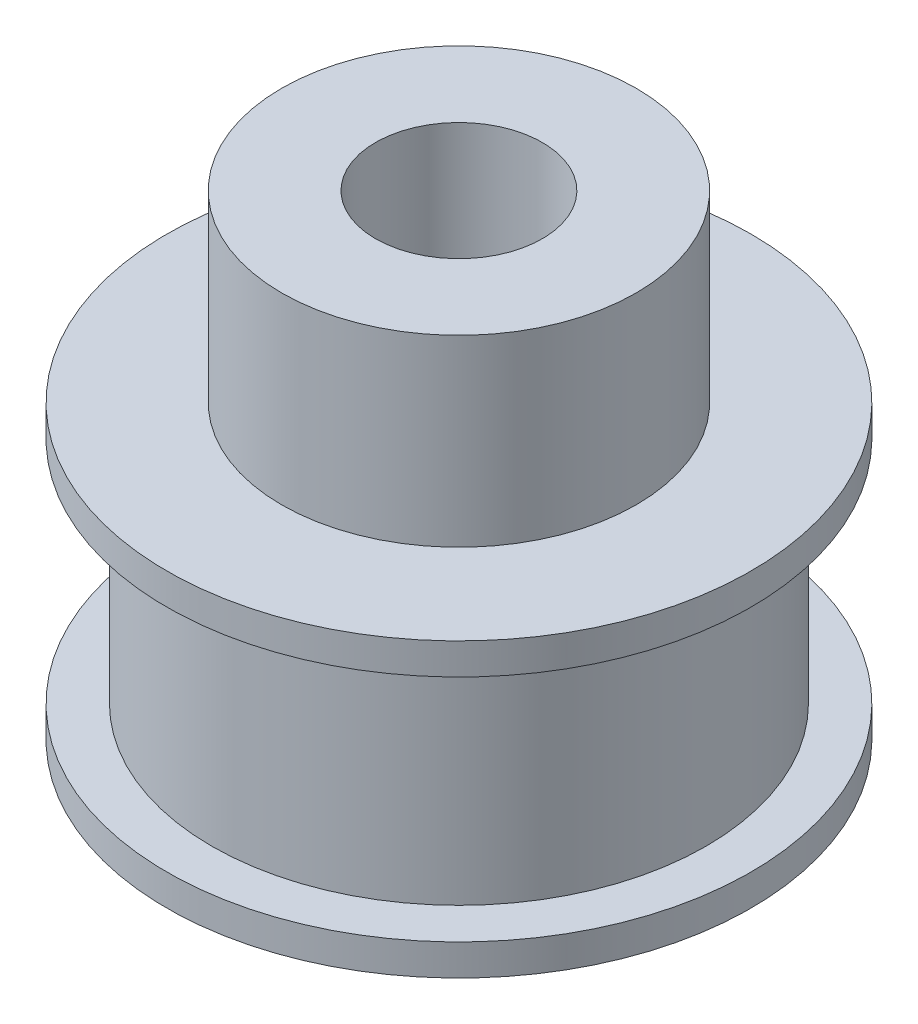
ISO-10303-21;
HEADER;
FILE_DESCRIPTION(('STEP AP214'),'2;1');
FILE_NAME('part.step','',(''),(''),'','','');
FILE_SCHEMA(('AUTOMOTIVE_DESIGN { 1 0 10303 214 1 1 1 1 }'));
ENDSEC;
DATA;
#1=APPLICATION_CONTEXT('core data for automotive mechanical design processes');
#2=APPLICATION_PROTOCOL_DEFINITION('international standard','automotive_design',2000,#1);
#3=PRODUCT_CONTEXT('',#1,'mechanical');
#4=PRODUCT('Part','Part','',(#3));
#5=PRODUCT_RELATED_PRODUCT_CATEGORY('part','',(#4));
#6=PRODUCT_DEFINITION_FORMATION('','',#4);
#7=PRODUCT_DEFINITION_CONTEXT('part definition',#1,'design');
#8=PRODUCT_DEFINITION('design','',#6,#7);
#9=PRODUCT_DEFINITION_SHAPE('','',#8);
#10=(LENGTH_UNIT() NAMED_UNIT(*) SI_UNIT(.MILLI.,.METRE.));
#11=(NAMED_UNIT(*) PLANE_ANGLE_UNIT() SI_UNIT($,.RADIAN.));
#12=(NAMED_UNIT(*) SI_UNIT($,.STERADIAN.) SOLID_ANGLE_UNIT());
#13=UNCERTAINTY_MEASURE_WITH_UNIT(LENGTH_MEASURE(1.E-05),#10,'distance_accuracy_value','');
#14=(GEOMETRIC_REPRESENTATION_CONTEXT(3) GLOBAL_UNCERTAINTY_ASSIGNED_CONTEXT((#13)) GLOBAL_UNIT_ASSIGNED_CONTEXT((#10,
#11,#12)) REPRESENTATION_CONTEXT('',''));
#15=CARTESIAN_POINT('',(0.,0.,0.));
#16=DIRECTION('',(0.,0.,1.));
#17=DIRECTION('',(1.,0.,0.));
#18=AXIS2_PLACEMENT_3D('',#15,#16,#17);
#19=CARTESIAN_POINT('',(0.,25.,0.));
#20=DIRECTION('',(0.,-1.,0.));
#21=DIRECTION('',(0.,0.,-1.));
#22=AXIS2_PLACEMENT_3D('',#19,#20,#21);
#23=CYLINDRICAL_SURFACE('',#22,8.5);
#24=CARTESIAN_POINT('',(0.,14.,0.));
#25=DIRECTION('',(0.,-1.,0.));
#26=DIRECTION('',(0.,0.,-1.));
#27=AXIS2_PLACEMENT_3D('',#24,#25,#26);
#28=CIRCLE('',#27,8.5);
#29=CARTESIAN_POINT('',(0.,14.,-8.5));
#30=VERTEX_POINT('',#29);
#31=EDGE_CURVE('E64',#30,#30,#28,.F.);
#32=ORIENTED_EDGE('',*,*,#31,.T.);
#33=EDGE_LOOP('',(#32));
#34=FACE_BOUND('',#33,.T.);
#35=CARTESIAN_POINT('',(0.,22.8,0.));
#36=DIRECTION('',(0.,1.,0.));
#37=DIRECTION('',(0.,0.,1.));
#38=AXIS2_PLACEMENT_3D('',#35,#36,#37);
#39=CIRCLE('',#38,8.5);
#40=CARTESIAN_POINT('',(0.,22.8,8.5));
#41=VERTEX_POINT('',#40);
#42=EDGE_CURVE('E54',#41,#41,#39,.T.);
#43=ORIENTED_EDGE('',*,*,#42,.F.);
#44=EDGE_LOOP('',(#43));
#45=FACE_BOUND('',#44,.T.);
#46=ADVANCED_FACE('F38',(#34,#45),#23,.T.);
#47=CARTESIAN_POINT('',(0.,0.,0.));
#48=DIRECTION('',(0.,1.,0.));
#49=DIRECTION('',(0.,0.,1.));
#50=AXIS2_PLACEMENT_3D('',#47,#48,#49);
#51=CYLINDRICAL_SURFACE('',#50,4.);
#52=CARTESIAN_POINT('',(0.,0.,0.));
#53=DIRECTION('',(0.,1.,0.));
#54=DIRECTION('',(0.,0.,1.));
#55=AXIS2_PLACEMENT_3D('',#52,#53,#54);
#56=CIRCLE('',#55,4.);
#57=CARTESIAN_POINT('',(0.,0.,4.));
#58=VERTEX_POINT('',#57);
#59=EDGE_CURVE('E46',#58,#58,#56,.F.);
#60=ORIENTED_EDGE('',*,*,#59,.T.);
#61=EDGE_LOOP('',(#60));
#62=FACE_BOUND('',#61,.T.);
#63=CARTESIAN_POINT('',(0.,22.8,0.));
#64=DIRECTION('',(0.,1.,0.));
#65=DIRECTION('',(0.,0.,1.));
#66=AXIS2_PLACEMENT_3D('',#63,#64,#65);
#67=CIRCLE('',#66,4.);
#68=CARTESIAN_POINT('',(0.,22.8,4.));
#69=VERTEX_POINT('',#68);
#70=EDGE_CURVE('E42',#69,#69,#67,.F.);
#71=ORIENTED_EDGE('',*,*,#70,.F.);
#72=EDGE_LOOP('',(#71));
#73=FACE_BOUND('',#72,.T.);
#74=ADVANCED_FACE('F82',(#62,#73),#51,.F.);
#75=CARTESIAN_POINT('',(0.,14.,0.));
#76=DIRECTION('',(0.,-1.,0.));
#77=DIRECTION('',(0.,0.,-1.));
#78=AXIS2_PLACEMENT_3D('',#75,#76,#77);
#79=CYLINDRICAL_SURFACE('',#78,14.);
#80=CARTESIAN_POINT('',(0.,14.,0.));
#81=DIRECTION('',(0.,-1.,0.));
#82=DIRECTION('',(0.,0.,-1.));
#83=AXIS2_PLACEMENT_3D('',#80,#81,#82);
#84=CIRCLE('',#83,14.);
#85=CARTESIAN_POINT('',(0.,14.,-14.));
#86=VERTEX_POINT('',#85);
#87=EDGE_CURVE('E69',#86,#86,#84,.F.);
#88=ORIENTED_EDGE('',*,*,#87,.F.);
#89=EDGE_LOOP('',(#88));
#90=FACE_BOUND('',#89,.T.);
#91=CARTESIAN_POINT('',(0.,12.5,0.));
#92=DIRECTION('',(0.,-1.,0.));
#93=DIRECTION('',(0.,0.,-1.));
#94=AXIS2_PLACEMENT_3D('',#91,#92,#93);
#95=CIRCLE('',#94,14.);
#96=CARTESIAN_POINT('',(0.,12.5,-14.));
#97=VERTEX_POINT('',#96);
#98=EDGE_CURVE('E67',#97,#97,#95,.F.);
#99=ORIENTED_EDGE('',*,*,#98,.T.);
#100=EDGE_LOOP('',(#99));
#101=FACE_BOUND('',#100,.T.);
#102=ADVANCED_FACE('F40',(#90,#101),#79,.T.);
#103=CARTESIAN_POINT('',(0.,14.,0.));
#104=DIRECTION('',(0.,1.,0.));
#105=DIRECTION('',(0.,0.,1.));
#106=AXIS2_PLACEMENT_3D('',#103,#104,#105);
#107=PLANE('',#106);
#108=ORIENTED_EDGE('',*,*,#87,.T.);
#109=EDGE_LOOP('',(#108));
#110=FACE_BOUND('',#109,.T.);
#111=ORIENTED_EDGE('',*,*,#31,.F.);
#112=EDGE_LOOP('',(#111));
#113=FACE_BOUND('',#112,.T.);
#114=ADVANCED_FACE('F97',(#110,#113),#107,.T.);
#115=CARTESIAN_POINT('',(0.,12.5,0.));
#116=DIRECTION('',(0.,1.,0.));
#117=DIRECTION('',(0.,0.,1.));
#118=AXIS2_PLACEMENT_3D('',#115,#116,#117);
#119=PLANE('',#118);
#120=ORIENTED_EDGE('',*,*,#98,.F.);
#121=EDGE_LOOP('',(#120));
#122=FACE_BOUND('',#121,.T.);
#123=CARTESIAN_POINT('',(0.,12.5,0.));
#124=DIRECTION('',(0.,-1.,0.));
#125=DIRECTION('',(0.,0.,-1.));
#126=AXIS2_PLACEMENT_3D('',#123,#124,#125);
#127=CIRCLE('',#126,11.85);
#128=CARTESIAN_POINT('',(0.,12.5,-11.85));
#129=VERTEX_POINT('',#128);
#130=EDGE_CURVE('E61',#129,#129,#127,.T.);
#131=ORIENTED_EDGE('',*,*,#130,.F.);
#132=EDGE_LOOP('',(#131));
#133=FACE_BOUND('',#132,.T.);
#134=ADVANCED_FACE('F95',(#122,#133),#119,.F.);
#135=CARTESIAN_POINT('',(0.,12.5,0.));
#136=DIRECTION('',(0.,-1.,0.));
#137=DIRECTION('',(0.,0.,-1.));
#138=AXIS2_PLACEMENT_3D('',#135,#136,#137);
#139=CYLINDRICAL_SURFACE('',#138,11.85);
#140=CARTESIAN_POINT('',(0.,1.5,0.));
#141=DIRECTION('',(0.,-1.,0.));
#142=DIRECTION('',(0.,0.,-1.));
#143=AXIS2_PLACEMENT_3D('',#140,#141,#142);
#144=CIRCLE('',#143,11.85);
#145=CARTESIAN_POINT('',(0.,1.5,-11.85));
#146=VERTEX_POINT('',#145);
#147=EDGE_CURVE('E58',#146,#146,#144,.T.);
#148=ORIENTED_EDGE('',*,*,#147,.F.);
#149=EDGE_LOOP('',(#148));
#150=FACE_BOUND('',#149,.T.);
#151=ORIENTED_EDGE('',*,*,#130,.T.);
#152=EDGE_LOOP('',(#151));
#153=FACE_BOUND('',#152,.T.);
#154=ADVANCED_FACE('F93',(#150,#153),#139,.T.);
#155=CARTESIAN_POINT('',(0.,1.5,0.));
#156=DIRECTION('',(0.,1.,0.));
#157=DIRECTION('',(0.,0.,1.));
#158=AXIS2_PLACEMENT_3D('',#155,#156,#157);
#159=PLANE('',#158);
#160=CARTESIAN_POINT('',(0.,1.5,0.));
#161=DIRECTION('',(0.,-1.,0.));
#162=DIRECTION('',(0.,0.,-1.));
#163=AXIS2_PLACEMENT_3D('',#160,#161,#162);
#164=CIRCLE('',#163,14.);
#165=CARTESIAN_POINT('',(0.,1.5,-14.));
#166=VERTEX_POINT('',#165);
#167=EDGE_CURVE('E51',#166,#166,#164,.T.);
#168=ORIENTED_EDGE('',*,*,#167,.F.);
#169=EDGE_LOOP('',(#168));
#170=FACE_BOUND('',#169,.T.);
#171=ORIENTED_EDGE('',*,*,#147,.T.);
#172=EDGE_LOOP('',(#171));
#173=FACE_BOUND('',#172,.T.);
#174=ADVANCED_FACE('F119',(#170,#173),#159,.T.);
#175=CARTESIAN_POINT('',(0.,1.5,0.));
#176=DIRECTION('',(0.,-1.,0.));
#177=DIRECTION('',(0.,0.,-1.));
#178=AXIS2_PLACEMENT_3D('',#175,#176,#177);
#179=CYLINDRICAL_SURFACE('',#178,14.);
#180=ORIENTED_EDGE('',*,*,#167,.T.);
#181=EDGE_LOOP('',(#180));
#182=FACE_BOUND('',#181,.T.);
#183=CARTESIAN_POINT('',(0.,0.,0.));
#184=DIRECTION('',(0.,-1.,0.));
#185=DIRECTION('',(0.,0.,-1.));
#186=AXIS2_PLACEMENT_3D('',#183,#184,#185);
#187=CIRCLE('',#186,14.);
#188=CARTESIAN_POINT('',(0.,0.,-14.));
#189=VERTEX_POINT('',#188);
#190=EDGE_CURVE('E10',#189,#189,#187,.F.);
#191=ORIENTED_EDGE('',*,*,#190,.T.);
#192=EDGE_LOOP('',(#191));
#193=FACE_BOUND('',#192,.T.);
#194=ADVANCED_FACE('F114',(#182,#193),#179,.T.);
#195=CARTESIAN_POINT('',(0.,0.,0.));
#196=DIRECTION('',(0.,1.,0.));
#197=DIRECTION('',(0.,0.,1.));
#198=AXIS2_PLACEMENT_3D('',#195,#196,#197);
#199=PLANE('',#198);
#200=ORIENTED_EDGE('',*,*,#190,.F.);
#201=EDGE_LOOP('',(#200));
#202=FACE_BOUND('',#201,.T.);
#203=ORIENTED_EDGE('',*,*,#59,.F.);
#204=EDGE_LOOP('',(#203));
#205=FACE_BOUND('',#204,.T.);
#206=ADVANCED_FACE('F90',(#202,#205),#199,.F.);
#207=CARTESIAN_POINT('',(0.,22.8,0.));
#208=DIRECTION('',(0.,1.,0.));
#209=DIRECTION('',(0.,0.,1.));
#210=AXIS2_PLACEMENT_3D('',#207,#208,#209);
#211=PLANE('',#210);
#212=ORIENTED_EDGE('',*,*,#42,.T.);
#213=EDGE_LOOP('',(#212));
#214=FACE_BOUND('',#213,.T.);
#215=ORIENTED_EDGE('',*,*,#70,.T.);
#216=EDGE_LOOP('',(#215));
#217=FACE_BOUND('',#216,.T.);
#218=ADVANCED_FACE('F79',(#214,#217),#211,.T.);
#219=CLOSED_SHELL('',(#46,#74,#102,#114,#134,#154,#174,#194,#206,#218));
#220=MANIFOLD_SOLID_BREP('B2',#219);
#221=ADVANCED_BREP_SHAPE_REPRESENTATION('',(#18,#220),#14);
#222=SHAPE_DEFINITION_REPRESENTATION(#9,#221);
ENDSEC;
END-ISO-10303-21;
